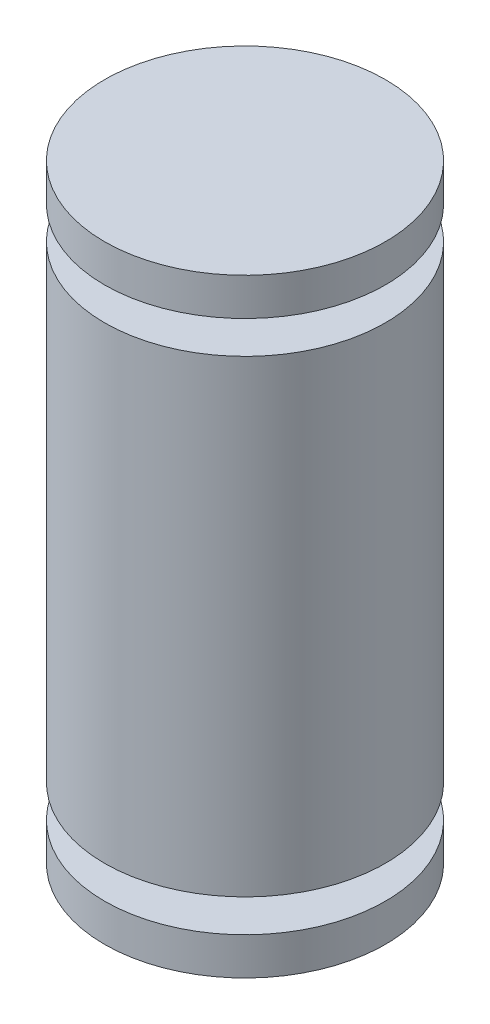
ISO-10303-21;
HEADER;
FILE_DESCRIPTION(('STEP AP214'),'2;1');
FILE_NAME('part.step','',(''),(''),'','','');
FILE_SCHEMA(('AUTOMOTIVE_DESIGN { 1 0 10303 214 1 1 1 1 }'));
ENDSEC;
DATA;
#1=APPLICATION_CONTEXT('core data for automotive mechanical design processes');
#2=APPLICATION_PROTOCOL_DEFINITION('international standard','automotive_design',2000,#1);
#3=PRODUCT_CONTEXT('',#1,'mechanical');
#4=PRODUCT('Part','Part','',(#3));
#5=PRODUCT_RELATED_PRODUCT_CATEGORY('part','',(#4));
#6=PRODUCT_DEFINITION_FORMATION('','',#4);
#7=PRODUCT_DEFINITION_CONTEXT('part definition',#1,'design');
#8=PRODUCT_DEFINITION('design','',#6,#7);
#9=PRODUCT_DEFINITION_SHAPE('','',#8);
#10=(LENGTH_UNIT() NAMED_UNIT(*) SI_UNIT(.MILLI.,.METRE.));
#11=(NAMED_UNIT(*) PLANE_ANGLE_UNIT() SI_UNIT($,.RADIAN.));
#12=(NAMED_UNIT(*) SI_UNIT($,.STERADIAN.) SOLID_ANGLE_UNIT());
#13=UNCERTAINTY_MEASURE_WITH_UNIT(LENGTH_MEASURE(1.E-05),#10,'distance_accuracy_value','');
#14=(GEOMETRIC_REPRESENTATION_CONTEXT(3) GLOBAL_UNCERTAINTY_ASSIGNED_CONTEXT((#13)) GLOBAL_UNIT_ASSIGNED_CONTEXT((#10,
#11,#12)) REPRESENTATION_CONTEXT('',''));
#15=CARTESIAN_POINT('',(0.,0.,0.));
#16=DIRECTION('',(0.,0.,1.));
#17=DIRECTION('',(1.,0.,0.));
#18=AXIS2_PLACEMENT_3D('',#15,#16,#17);
#19=CARTESIAN_POINT('',(-3.,14.,0.));
#20=DIRECTION('',(0.,1.,0.));
#21=DIRECTION('',(0.,0.,1.));
#22=AXIS2_PLACEMENT_3D('',#19,#20,#21);
#23=CYLINDRICAL_SURFACE('',#22,2.);
#24=CARTESIAN_POINT('',(-3.,2.5,0.));
#25=DIRECTION('',(0.,1.,0.));
#26=DIRECTION('',(0.,0.,1.));
#27=AXIS2_PLACEMENT_3D('',#24,#25,#26);
#28=CIRCLE('',#27,2.);
#29=CARTESIAN_POINT('',(-3.,2.5,2.));
#30=VERTEX_POINT('',#29);
#31=EDGE_CURVE('E10',#30,#30,#28,.T.);
#32=ORIENTED_EDGE('',*,*,#31,.F.);
#33=EDGE_LOOP('',(#32));
#34=FACE_BOUND('',#33,.T.);
#35=CARTESIAN_POINT('',(-3.,1.8,0.));
#36=DIRECTION('',(0.,1.,0.));
#37=DIRECTION('',(0.,0.,1.));
#38=AXIS2_PLACEMENT_3D('',#35,#36,#37);
#39=CIRCLE('',#38,2.);
#40=CARTESIAN_POINT('',(-3.,1.8,2.));
#41=VERTEX_POINT('',#40);
#42=EDGE_CURVE('E69',#41,#41,#39,.T.);
#43=ORIENTED_EDGE('',*,*,#42,.T.);
#44=EDGE_LOOP('',(#43));
#45=FACE_BOUND('',#44,.T.);
#46=ADVANCED_FACE('F35',(#34,#45),#23,.T.);
#47=CARTESIAN_POINT('',(0.,2.5,0.));
#48=DIRECTION('',(0.,1.,0.));
#49=DIRECTION('',(0.,0.,1.));
#50=AXIS2_PLACEMENT_3D('',#47,#48,#49);
#51=PLANE('',#50);
#52=CARTESIAN_POINT('',(-3.,2.5,0.));
#53=DIRECTION('',(0.,1.,0.));
#54=DIRECTION('',(0.,0.,1.));
#55=AXIS2_PLACEMENT_3D('',#52,#53,#54);
#56=CIRCLE('',#55,3.);
#57=CARTESIAN_POINT('',(-3.,2.5,3.));
#58=VERTEX_POINT('',#57);
#59=EDGE_CURVE('E41',#58,#58,#56,.T.);
#60=ORIENTED_EDGE('',*,*,#59,.F.);
#61=EDGE_LOOP('',(#60));
#62=FACE_BOUND('',#61,.T.);
#63=ORIENTED_EDGE('',*,*,#31,.T.);
#64=EDGE_LOOP('',(#63));
#65=FACE_BOUND('',#64,.T.);
#66=ADVANCED_FACE('F97',(#62,#65),#51,.F.);
#67=CARTESIAN_POINT('',(-3.,14.,0.));
#68=DIRECTION('',(0.,1.,0.));
#69=DIRECTION('',(0.,0.,1.));
#70=AXIS2_PLACEMENT_3D('',#67,#68,#69);
#71=CYLINDRICAL_SURFACE('',#70,3.);
#72=CARTESIAN_POINT('',(-3.,12.5,0.));
#73=DIRECTION('',(0.,1.,0.));
#74=DIRECTION('',(0.,0.,1.));
#75=AXIS2_PLACEMENT_3D('',#72,#73,#74);
#76=CIRCLE('',#75,3.);
#77=CARTESIAN_POINT('',(-3.,12.5,3.));
#78=VERTEX_POINT('',#77);
#79=EDGE_CURVE('E45',#78,#78,#76,.T.);
#80=ORIENTED_EDGE('',*,*,#79,.F.);
#81=EDGE_LOOP('',(#80));
#82=FACE_BOUND('',#81,.T.);
#83=ORIENTED_EDGE('',*,*,#59,.T.);
#84=EDGE_LOOP('',(#83));
#85=FACE_BOUND('',#84,.T.);
#86=ADVANCED_FACE('F102',(#82,#85),#71,.T.);
#87=CARTESIAN_POINT('',(0.,12.5,0.));
#88=DIRECTION('',(0.,-1.,0.));
#89=DIRECTION('',(0.,0.,-1.));
#90=AXIS2_PLACEMENT_3D('',#87,#88,#89);
#91=PLANE('',#90);
#92=CARTESIAN_POINT('',(-3.,12.5,0.));
#93=DIRECTION('',(0.,1.,0.));
#94=DIRECTION('',(0.,0.,1.));
#95=AXIS2_PLACEMENT_3D('',#92,#93,#94);
#96=CIRCLE('',#95,2.);
#97=CARTESIAN_POINT('',(-3.,12.5,2.));
#98=VERTEX_POINT('',#97);
#99=EDGE_CURVE('E49',#98,#98,#96,.T.);
#100=ORIENTED_EDGE('',*,*,#99,.F.);
#101=EDGE_LOOP('',(#100));
#102=FACE_BOUND('',#101,.T.);
#103=ORIENTED_EDGE('',*,*,#79,.T.);
#104=EDGE_LOOP('',(#103));
#105=FACE_BOUND('',#104,.T.);
#106=ADVANCED_FACE('F107',(#102,#105),#91,.F.);
#107=CARTESIAN_POINT('',(-3.,14.,0.));
#108=DIRECTION('',(0.,1.,0.));
#109=DIRECTION('',(0.,0.,1.));
#110=AXIS2_PLACEMENT_3D('',#107,#108,#109);
#111=CYLINDRICAL_SURFACE('',#110,2.);
#112=CARTESIAN_POINT('',(-3.,13.2,0.));
#113=DIRECTION('',(0.,1.,0.));
#114=DIRECTION('',(0.,0.,1.));
#115=AXIS2_PLACEMENT_3D('',#112,#113,#114);
#116=CIRCLE('',#115,2.);
#117=CARTESIAN_POINT('',(-3.,13.2,2.));
#118=VERTEX_POINT('',#117);
#119=EDGE_CURVE('E54',#118,#118,#116,.T.);
#120=ORIENTED_EDGE('',*,*,#119,.F.);
#121=EDGE_LOOP('',(#120));
#122=FACE_BOUND('',#121,.T.);
#123=ORIENTED_EDGE('',*,*,#99,.T.);
#124=EDGE_LOOP('',(#123));
#125=FACE_BOUND('',#124,.T.);
#126=ADVANCED_FACE('F113',(#122,#125),#111,.T.);
#127=CARTESIAN_POINT('',(-0.999999999999999,13.2,0.));
#128=DIRECTION('',(0.,1.,0.));
#129=DIRECTION('',(0.,0.,1.));
#130=AXIS2_PLACEMENT_3D('',#127,#128,#129);
#131=PLANE('',#130);
#132=CARTESIAN_POINT('',(-3.,13.2,0.));
#133=DIRECTION('',(0.,1.,0.));
#134=DIRECTION('',(0.,0.,1.));
#135=AXIS2_PLACEMENT_3D('',#132,#133,#134);
#136=CIRCLE('',#135,3.);
#137=CARTESIAN_POINT('',(-3.,13.2,3.));
#138=VERTEX_POINT('',#137);
#139=EDGE_CURVE('E57',#138,#138,#136,.T.);
#140=ORIENTED_EDGE('',*,*,#139,.F.);
#141=EDGE_LOOP('',(#140));
#142=FACE_BOUND('',#141,.T.);
#143=ORIENTED_EDGE('',*,*,#119,.T.);
#144=EDGE_LOOP('',(#143));
#145=FACE_BOUND('',#144,.T.);
#146=ADVANCED_FACE('F117',(#142,#145),#131,.F.);
#147=CARTESIAN_POINT('',(-3.,14.,0.));
#148=DIRECTION('',(0.,1.,0.));
#149=DIRECTION('',(0.,0.,1.));
#150=AXIS2_PLACEMENT_3D('',#147,#148,#149);
#151=CYLINDRICAL_SURFACE('',#150,3.);
#152=CARTESIAN_POINT('',(-3.,14.,0.));
#153=DIRECTION('',(0.,1.,0.));
#154=DIRECTION('',(0.,0.,1.));
#155=AXIS2_PLACEMENT_3D('',#152,#153,#154);
#156=CIRCLE('',#155,3.);
#157=CARTESIAN_POINT('',(-3.,14.,3.));
#158=VERTEX_POINT('',#157);
#159=EDGE_CURVE('E60',#158,#158,#156,.T.);
#160=ORIENTED_EDGE('',*,*,#159,.F.);
#161=EDGE_LOOP('',(#160));
#162=FACE_BOUND('',#161,.T.);
#163=ORIENTED_EDGE('',*,*,#139,.T.);
#164=EDGE_LOOP('',(#163));
#165=FACE_BOUND('',#164,.T.);
#166=ADVANCED_FACE('F93',(#162,#165),#151,.T.);
#167=CARTESIAN_POINT('',(0.,14.,0.));
#168=DIRECTION('',(0.,-1.,0.));
#169=DIRECTION('',(0.,0.,-1.));
#170=AXIS2_PLACEMENT_3D('',#167,#168,#169);
#171=PLANE('',#170);
#172=ORIENTED_EDGE('',*,*,#159,.T.);
#173=EDGE_LOOP('',(#172));
#174=FACE_BOUND('',#173,.T.);
#175=ADVANCED_FACE('F88',(#174),#171,.F.);
#176=CARTESIAN_POINT('',(-3.,1.,0.));
#177=DIRECTION('',(0.,1.,0.));
#178=DIRECTION('',(0.,0.,1.));
#179=AXIS2_PLACEMENT_3D('',#176,#177,#178);
#180=PLANE('',#179);
#181=CARTESIAN_POINT('',(-3.,1.,0.));
#182=DIRECTION('',(0.,1.,0.));
#183=DIRECTION('',(0.,0.,1.));
#184=AXIS2_PLACEMENT_3D('',#181,#182,#183);
#185=CIRCLE('',#184,3.);
#186=CARTESIAN_POINT('',(-3.,1.,3.));
#187=VERTEX_POINT('',#186);
#188=EDGE_CURVE('E63',#187,#187,#185,.T.);
#189=ORIENTED_EDGE('',*,*,#188,.F.);
#190=EDGE_LOOP('',(#189));
#191=FACE_BOUND('',#190,.T.);
#192=ADVANCED_FACE('F83',(#191),#180,.F.);
#193=CARTESIAN_POINT('',(-3.,14.,0.));
#194=DIRECTION('',(0.,1.,0.));
#195=DIRECTION('',(0.,0.,1.));
#196=AXIS2_PLACEMENT_3D('',#193,#194,#195);
#197=CYLINDRICAL_SURFACE('',#196,3.);
#198=CARTESIAN_POINT('',(-3.,1.8,0.));
#199=DIRECTION('',(0.,1.,0.));
#200=DIRECTION('',(0.,0.,1.));
#201=AXIS2_PLACEMENT_3D('',#198,#199,#200);
#202=CIRCLE('',#201,3.);
#203=CARTESIAN_POINT('',(-3.,1.8,3.));
#204=VERTEX_POINT('',#203);
#205=EDGE_CURVE('E66',#204,#204,#202,.T.);
#206=ORIENTED_EDGE('',*,*,#205,.F.);
#207=EDGE_LOOP('',(#206));
#208=FACE_BOUND('',#207,.T.);
#209=ORIENTED_EDGE('',*,*,#188,.T.);
#210=EDGE_LOOP('',(#209));
#211=FACE_BOUND('',#210,.T.);
#212=ADVANCED_FACE('F77',(#208,#211),#197,.T.);
#213=CARTESIAN_POINT('',(-0.999999999999999,1.8,0.));
#214=DIRECTION('',(0.,-1.,0.));
#215=DIRECTION('',(0.,0.,-1.));
#216=AXIS2_PLACEMENT_3D('',#213,#214,#215);
#217=PLANE('',#216);
#218=ORIENTED_EDGE('',*,*,#42,.F.);
#219=EDGE_LOOP('',(#218));
#220=FACE_BOUND('',#219,.T.);
#221=ORIENTED_EDGE('',*,*,#205,.T.);
#222=EDGE_LOOP('',(#221));
#223=FACE_BOUND('',#222,.T.);
#224=ADVANCED_FACE('F74',(#220,#223),#217,.F.);
#225=CLOSED_SHELL('',(#46,#66,#86,#106,#126,#146,#166,#175,#192,#212,#224));
#226=MANIFOLD_SOLID_BREP('B2',#225);
#227=ADVANCED_BREP_SHAPE_REPRESENTATION('',(#18,#226),#14);
#228=SHAPE_DEFINITION_REPRESENTATION(#9,#227);
ENDSEC;
END-ISO-10303-21;
